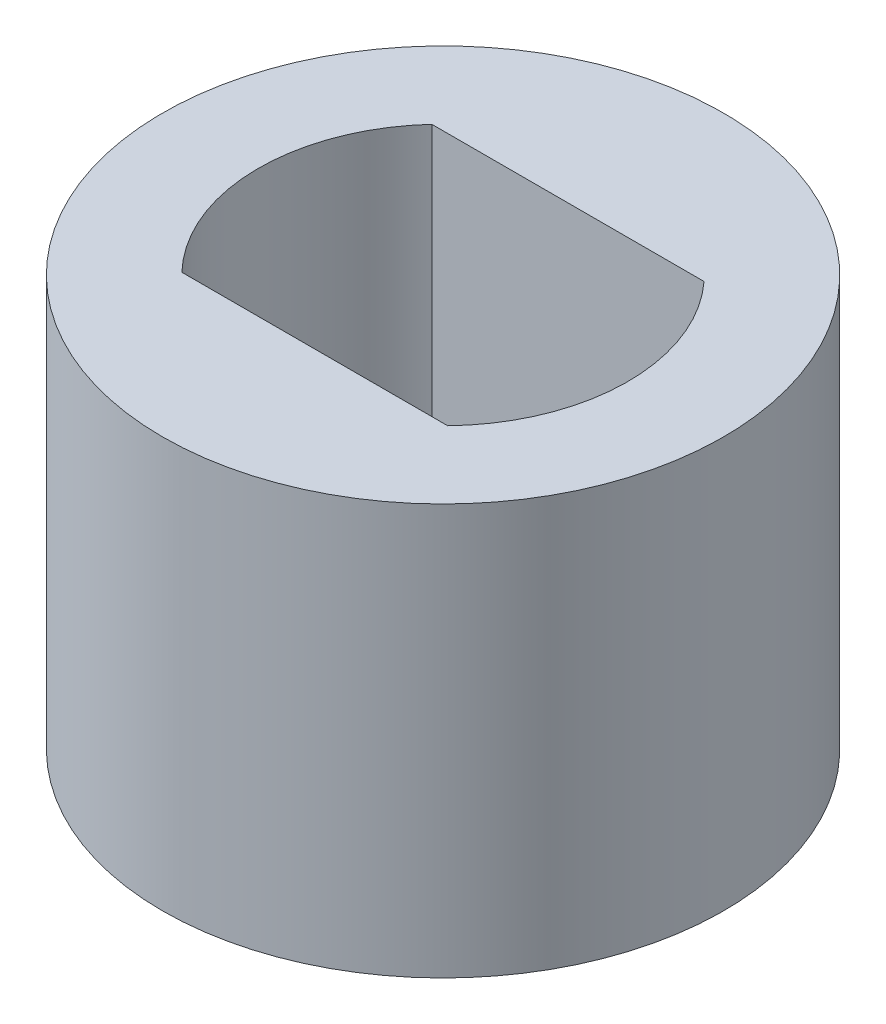
ISO-10303-21;
HEADER;
FILE_DESCRIPTION(('STEP AP214'),'2;1');
FILE_NAME('part.step','',(''),(''),'','','');
FILE_SCHEMA(('AUTOMOTIVE_DESIGN { 1 0 10303 214 1 1 1 1 }'));
ENDSEC;
DATA;
#1=APPLICATION_CONTEXT('core data for automotive mechanical design processes');
#2=APPLICATION_PROTOCOL_DEFINITION('international standard','automotive_design',2000,#1);
#3=PRODUCT_CONTEXT('',#1,'mechanical');
#4=PRODUCT('Part','Part','',(#3));
#5=PRODUCT_RELATED_PRODUCT_CATEGORY('part','',(#4));
#6=PRODUCT_DEFINITION_FORMATION('','',#4);
#7=PRODUCT_DEFINITION_CONTEXT('part definition',#1,'design');
#8=PRODUCT_DEFINITION('design','',#6,#7);
#9=PRODUCT_DEFINITION_SHAPE('','',#8);
#10=(LENGTH_UNIT() NAMED_UNIT(*) SI_UNIT(.MILLI.,.METRE.));
#11=(NAMED_UNIT(*) PLANE_ANGLE_UNIT() SI_UNIT($,.RADIAN.));
#12=(NAMED_UNIT(*) SI_UNIT($,.STERADIAN.) SOLID_ANGLE_UNIT());
#13=UNCERTAINTY_MEASURE_WITH_UNIT(LENGTH_MEASURE(1.E-05),#10,'distance_accuracy_value','');
#14=(GEOMETRIC_REPRESENTATION_CONTEXT(3) GLOBAL_UNCERTAINTY_ASSIGNED_CONTEXT((#13)) GLOBAL_UNIT_ASSIGNED_CONTEXT((#10,
#11,#12)) REPRESENTATION_CONTEXT('',''));
#15=CARTESIAN_POINT('',(0.,0.,0.));
#16=DIRECTION('',(0.,0.,1.));
#17=DIRECTION('',(1.,0.,0.));
#18=AXIS2_PLACEMENT_3D('',#15,#16,#17);
#19=CARTESIAN_POINT('',(0.,6.,0.));
#20=DIRECTION('',(0.,-1.,0.));
#21=DIRECTION('',(0.,0.,-1.));
#22=AXIS2_PLACEMENT_3D('',#19,#20,#21);
#23=CYLINDRICAL_SURFACE('',#22,4.1);
#24=CARTESIAN_POINT('',(0.,6.,0.));
#25=DIRECTION('',(0.,1.,0.));
#26=DIRECTION('',(0.,0.,1.));
#27=AXIS2_PLACEMENT_3D('',#24,#25,#26);
#28=CIRCLE('',#27,4.1);
#29=CARTESIAN_POINT('',(0.,6.,4.1));
#30=VERTEX_POINT('',#29);
#31=EDGE_CURVE('E106',#30,#30,#28,.T.);
#32=ORIENTED_EDGE('',*,*,#31,.F.);
#33=EDGE_LOOP('',(#32));
#34=FACE_BOUND('',#33,.T.);
#35=CARTESIAN_POINT('',(0.,0.,0.));
#36=DIRECTION('',(0.,1.,0.));
#37=DIRECTION('',(0.,0.,1.));
#38=AXIS2_PLACEMENT_3D('',#35,#36,#37);
#39=CIRCLE('',#38,4.1);
#40=CARTESIAN_POINT('',(0.,0.,4.1));
#41=VERTEX_POINT('',#40);
#42=EDGE_CURVE('E103',#41,#41,#39,.T.);
#43=ORIENTED_EDGE('',*,*,#42,.T.);
#44=EDGE_LOOP('',(#43));
#45=FACE_BOUND('',#44,.T.);
#46=ADVANCED_FACE('F37',(#34,#45),#23,.T.);
#47=CARTESIAN_POINT('',(0.,6.,0.));
#48=DIRECTION('',(0.,1.,0.));
#49=DIRECTION('',(0.,0.,1.));
#50=AXIS2_PLACEMENT_3D('',#47,#48,#49);
#51=PLANE('',#50);
#52=CARTESIAN_POINT('',(0.,6.,0.));
#53=DIRECTION('',(0.,1.,0.));
#54=DIRECTION('',(0.,0.,1.));
#55=AXIS2_PLACEMENT_3D('',#52,#53,#54);
#56=CIRCLE('',#55,2.7);
#57=CARTESIAN_POINT('',(1.94277507704829,6.,1.875));
#58=VERTEX_POINT('',#57);
#59=CARTESIAN_POINT('',(1.98981783085789,6.,-1.825));
#60=VERTEX_POINT('',#59);
#61=EDGE_CURVE('E51',#58,#60,#56,.T.);
#62=ORIENTED_EDGE('',*,*,#61,.F.);
#63=DIRECTION('',(1.,0.,0.));
#64=VECTOR('',#63,1.);
#65=CARTESIAN_POINT('',(-1.94277507704829,6.,1.875));
#66=LINE('',#65,#64);
#67=CARTESIAN_POINT('',(-1.94277507704829,6.,1.875));
#68=VERTEX_POINT('',#67);
#69=EDGE_CURVE('E96',#68,#58,#66,.T.);
#70=ORIENTED_EDGE('',*,*,#69,.F.);
#71=CARTESIAN_POINT('',(0.,6.,0.));
#72=DIRECTION('',(0.,1.,0.));
#73=DIRECTION('',(0.,0.,1.));
#74=AXIS2_PLACEMENT_3D('',#71,#72,#73);
#75=CIRCLE('',#74,2.7);
#76=CARTESIAN_POINT('',(-1.98981783085789,6.,-1.825));
#77=VERTEX_POINT('',#76);
#78=EDGE_CURVE('E80',#77,#68,#75,.T.);
#79=ORIENTED_EDGE('',*,*,#78,.F.);
#80=DIRECTION('',(-1.,0.,0.));
#81=VECTOR('',#80,1.);
#82=CARTESIAN_POINT('',(1.98981783085789,6.,-1.825));
#83=LINE('',#82,#81);
#84=EDGE_CURVE('E89',#60,#77,#83,.T.);
#85=ORIENTED_EDGE('',*,*,#84,.F.);
#86=EDGE_LOOP('',(#62,#70,#79,#85));
#87=FACE_BOUND('',#86,.T.);
#88=ORIENTED_EDGE('',*,*,#31,.T.);
#89=EDGE_LOOP('',(#88));
#90=FACE_BOUND('',#89,.T.);
#91=ADVANCED_FACE('F93',(#87,#90),#51,.T.);
#92=CARTESIAN_POINT('',(0.,0.,0.));
#93=DIRECTION('',(0.,1.,0.));
#94=DIRECTION('',(0.,0.,1.));
#95=AXIS2_PLACEMENT_3D('',#92,#93,#94);
#96=PLANE('',#95);
#97=DIRECTION('',(1.,0.,0.));
#98=VECTOR('',#97,1.);
#99=CARTESIAN_POINT('',(0.,0.,1.875));
#100=LINE('',#99,#98);
#101=CARTESIAN_POINT('',(-1.94277507704829,0.,1.875));
#102=VERTEX_POINT('',#101);
#103=CARTESIAN_POINT('',(1.94277507704829,0.,1.875));
#104=VERTEX_POINT('',#103);
#105=EDGE_CURVE('E44',#102,#104,#100,.T.);
#106=ORIENTED_EDGE('',*,*,#105,.T.);
#107=CARTESIAN_POINT('',(0.,0.,0.));
#108=DIRECTION('',(0.,1.,0.));
#109=DIRECTION('',(0.,0.,1.));
#110=AXIS2_PLACEMENT_3D('',#107,#108,#109);
#111=CIRCLE('',#110,2.7);
#112=CARTESIAN_POINT('',(1.98981783085789,0.,-1.825));
#113=VERTEX_POINT('',#112);
#114=EDGE_CURVE('E11',#104,#113,#111,.T.);
#115=ORIENTED_EDGE('',*,*,#114,.T.);
#116=DIRECTION('',(-1.,0.,0.));
#117=VECTOR('',#116,1.);
#118=CARTESIAN_POINT('',(0.,0.,-1.825));
#119=LINE('',#118,#117);
#120=CARTESIAN_POINT('',(-1.98981783085789,0.,-1.825));
#121=VERTEX_POINT('',#120);
#122=EDGE_CURVE('E109',#113,#121,#119,.T.);
#123=ORIENTED_EDGE('',*,*,#122,.T.);
#124=CARTESIAN_POINT('',(0.,0.,0.));
#125=DIRECTION('',(0.,1.,0.));
#126=DIRECTION('',(0.,0.,1.));
#127=AXIS2_PLACEMENT_3D('',#124,#125,#126);
#128=CIRCLE('',#127,2.7);
#129=EDGE_CURVE('E83',#121,#102,#128,.T.);
#130=ORIENTED_EDGE('',*,*,#129,.T.);
#131=EDGE_LOOP('',(#106,#115,#123,#130));
#132=FACE_BOUND('',#131,.T.);
#133=ORIENTED_EDGE('',*,*,#42,.F.);
#134=EDGE_LOOP('',(#133));
#135=FACE_BOUND('',#134,.T.);
#136=ADVANCED_FACE('F115',(#132,#135),#96,.F.);
#137=CARTESIAN_POINT('',(0.,-2.,0.));
#138=DIRECTION('',(0.,1.,0.));
#139=DIRECTION('',(0.,0.,1.));
#140=AXIS2_PLACEMENT_3D('',#137,#138,#139);
#141=CYLINDRICAL_SURFACE('',#140,2.7);
#142=DIRECTION('',(0.,1.,0.));
#143=VECTOR('',#142,1.);
#144=CARTESIAN_POINT('',(1.94277507704829,-2.,1.875));
#145=LINE('',#144,#143);
#146=EDGE_CURVE('E101',#104,#58,#145,.T.);
#147=ORIENTED_EDGE('',*,*,#146,.T.);
#148=ORIENTED_EDGE('',*,*,#61,.T.);
#149=DIRECTION('',(0.,1.,0.));
#150=VECTOR('',#149,1.);
#151=CARTESIAN_POINT('',(1.98981783085789,-2.,-1.825));
#152=LINE('',#151,#150);
#153=EDGE_CURVE('E86',#113,#60,#152,.T.);
#154=ORIENTED_EDGE('',*,*,#153,.F.);
#155=ORIENTED_EDGE('',*,*,#114,.F.);
#156=EDGE_LOOP('',(#147,#148,#154,#155));
#157=FACE_BOUND('',#156,.T.);
#158=ADVANCED_FACE('F120',(#157),#141,.F.);
#159=CARTESIAN_POINT('',(-1.94277507704829,-2.,1.875));
#160=DIRECTION('',(0.,0.,1.));
#161=DIRECTION('',(1.,0.,0.));
#162=AXIS2_PLACEMENT_3D('',#159,#160,#161);
#163=PLANE('',#162);
#164=DIRECTION('',(0.,1.,0.));
#165=VECTOR('',#164,1.);
#166=CARTESIAN_POINT('',(-1.94277507704829,-2.,1.875));
#167=LINE('',#166,#165);
#168=EDGE_CURVE('E85',#102,#68,#167,.T.);
#169=ORIENTED_EDGE('',*,*,#168,.T.);
#170=ORIENTED_EDGE('',*,*,#69,.T.);
#171=ORIENTED_EDGE('',*,*,#146,.F.);
#172=ORIENTED_EDGE('',*,*,#105,.F.);
#173=EDGE_LOOP('',(#169,#170,#171,#172));
#174=FACE_BOUND('',#173,.T.);
#175=ADVANCED_FACE('F119',(#174),#163,.F.);
#176=CARTESIAN_POINT('',(0.,-2.,0.));
#177=DIRECTION('',(0.,1.,0.));
#178=DIRECTION('',(0.,0.,1.));
#179=AXIS2_PLACEMENT_3D('',#176,#177,#178);
#180=CYLINDRICAL_SURFACE('',#179,2.7);
#181=DIRECTION('',(0.,1.,0.));
#182=VECTOR('',#181,1.);
#183=CARTESIAN_POINT('',(-1.98981783085789,-2.,-1.825));
#184=LINE('',#183,#182);
#185=EDGE_CURVE('E59',#121,#77,#184,.T.);
#186=ORIENTED_EDGE('',*,*,#185,.T.);
#187=ORIENTED_EDGE('',*,*,#78,.T.);
#188=ORIENTED_EDGE('',*,*,#168,.F.);
#189=ORIENTED_EDGE('',*,*,#129,.F.);
#190=EDGE_LOOP('',(#186,#187,#188,#189));
#191=FACE_BOUND('',#190,.T.);
#192=ADVANCED_FACE('F77',(#191),#180,.F.);
#193=CARTESIAN_POINT('',(1.98981783085789,-2.,-1.825));
#194=DIRECTION('',(0.,0.,-1.));
#195=DIRECTION('',(-1.,0.,0.));
#196=AXIS2_PLACEMENT_3D('',#193,#194,#195);
#197=PLANE('',#196);
#198=ORIENTED_EDGE('',*,*,#153,.T.);
#199=ORIENTED_EDGE('',*,*,#84,.T.);
#200=ORIENTED_EDGE('',*,*,#185,.F.);
#201=ORIENTED_EDGE('',*,*,#122,.F.);
#202=EDGE_LOOP('',(#198,#199,#200,#201));
#203=FACE_BOUND('',#202,.T.);
#204=ADVANCED_FACE('F90',(#203),#197,.F.);
#205=CLOSED_SHELL('',(#46,#91,#136,#158,#175,#192,#204));
#206=MANIFOLD_SOLID_BREP('B2',#205);
#207=ADVANCED_BREP_SHAPE_REPRESENTATION('',(#18,#206),#14);
#208=SHAPE_DEFINITION_REPRESENTATION(#9,#207);
ENDSEC;
END-ISO-10303-21;
